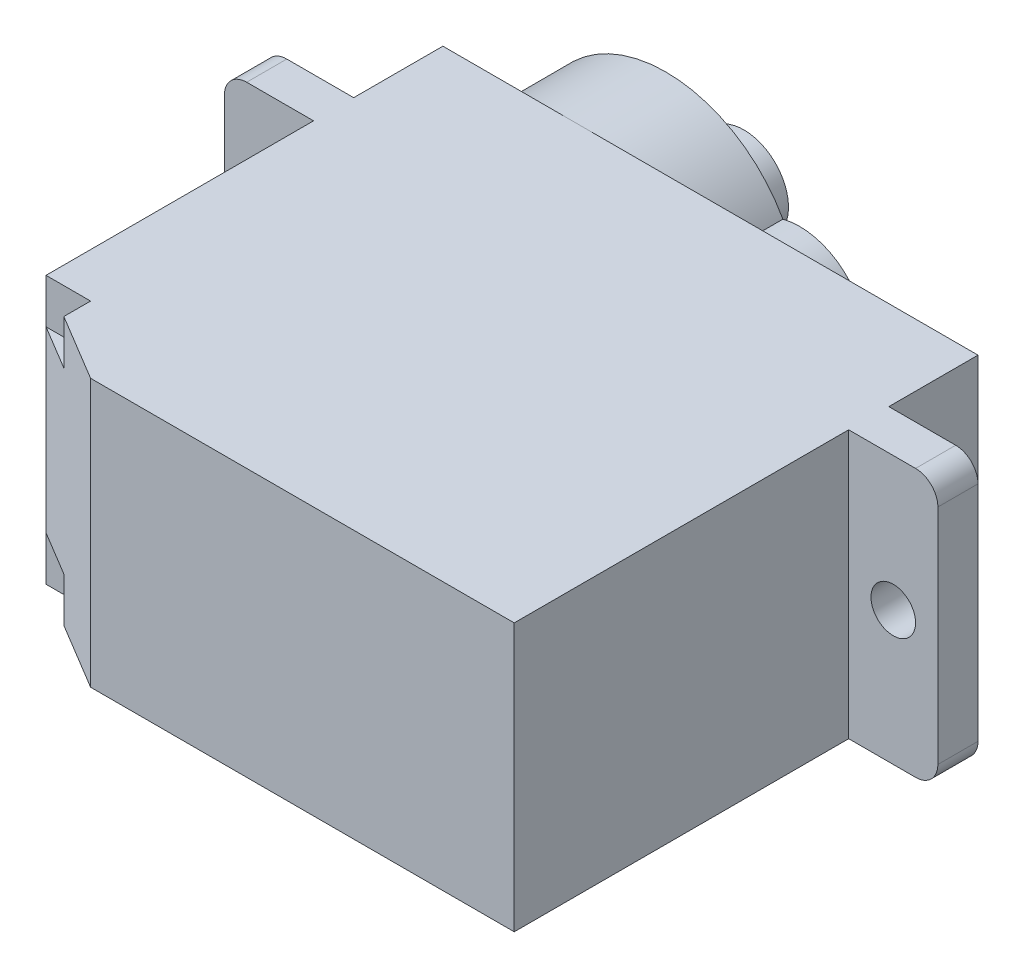
ISO-10303-21;
HEADER;
FILE_DESCRIPTION(('STEP AP214'),'2;1');
FILE_NAME('part.step','',(''),(''),'','','');
FILE_SCHEMA(('AUTOMOTIVE_DESIGN { 1 0 10303 214 1 1 1 1 }'));
ENDSEC;
DATA;
#1=APPLICATION_CONTEXT('core data for automotive mechanical design processes');
#2=APPLICATION_PROTOCOL_DEFINITION('international standard','automotive_design',2000,#1);
#3=PRODUCT_CONTEXT('',#1,'mechanical');
#4=PRODUCT('Part','Part','',(#3));
#5=PRODUCT_RELATED_PRODUCT_CATEGORY('part','',(#4));
#6=PRODUCT_DEFINITION_FORMATION('','',#4);
#7=PRODUCT_DEFINITION_CONTEXT('part definition',#1,'design');
#8=PRODUCT_DEFINITION('design','',#6,#7);
#9=PRODUCT_DEFINITION_SHAPE('','',#8);
#10=(LENGTH_UNIT() NAMED_UNIT(*) SI_UNIT(.MILLI.,.METRE.));
#11=(NAMED_UNIT(*) PLANE_ANGLE_UNIT() SI_UNIT($,.RADIAN.));
#12=(NAMED_UNIT(*) SI_UNIT($,.STERADIAN.) SOLID_ANGLE_UNIT());
#13=UNCERTAINTY_MEASURE_WITH_UNIT(LENGTH_MEASURE(1.E-05),#10,'distance_accuracy_value','');
#14=(GEOMETRIC_REPRESENTATION_CONTEXT(3) GLOBAL_UNCERTAINTY_ASSIGNED_CONTEXT((#13)) GLOBAL_UNIT_ASSIGNED_CONTEXT((#10,
#11,#12)) REPRESENTATION_CONTEXT('',''));
#15=CARTESIAN_POINT('',(0.,0.,0.));
#16=DIRECTION('',(0.,0.,1.));
#17=DIRECTION('',(1.,0.,0.));
#18=AXIS2_PLACEMENT_3D('',#15,#16,#17);
#19=CARTESIAN_POINT('',(0.,0.,12.));
#20=DIRECTION('',(0.,0.,-1.));
#21=DIRECTION('',(-1.,0.,0.));
#22=AXIS2_PLACEMENT_3D('',#19,#20,#21);
#23=PLANE('',#22);
#24=DIRECTION('',(0.,-1.,0.));
#25=VECTOR('',#24,1.);
#26=CARTESIAN_POINT('',(-10.,-6.,12.));
#27=LINE('',#26,#25);
#28=CARTESIAN_POINT('',(-10.,-4.,12.));
#29=VERTEX_POINT('',#28);
#30=CARTESIAN_POINT('',(-10.,-6.,12.));
#31=VERTEX_POINT('',#30);
#32=EDGE_CURVE('E232',#29,#31,#27,.T.);
#33=ORIENTED_EDGE('',*,*,#32,.F.);
#34=DIRECTION('',(1.,0.,0.));
#35=VECTOR('',#34,1.);
#36=CARTESIAN_POINT('',(-10.,-4.,12.));
#37=LINE('',#36,#35);
#38=CARTESIAN_POINT('',(-12.,-4.,12.));
#39=VERTEX_POINT('',#38);
#40=EDGE_CURVE('E235',#39,#29,#37,.T.);
#41=ORIENTED_EDGE('',*,*,#40,.F.);
#42=DIRECTION('',(0.,-1.,0.));
#43=VECTOR('',#42,1.);
#44=CARTESIAN_POINT('',(-12.,-6.,12.));
#45=LINE('',#44,#43);
#46=CARTESIAN_POINT('',(-12.,-6.,12.));
#47=VERTEX_POINT('',#46);
#48=EDGE_CURVE('E387',#39,#47,#45,.T.);
#49=ORIENTED_EDGE('',*,*,#48,.T.);
#50=DIRECTION('',(1.,0.,0.));
#51=VECTOR('',#50,1.);
#52=CARTESIAN_POINT('',(-12.,-6.,12.));
#53=LINE('',#52,#51);
#54=EDGE_CURVE('E392',#47,#31,#53,.T.);
#55=ORIENTED_EDGE('',*,*,#54,.T.);
#56=EDGE_LOOP('',(#33,#41,#49,#55));
#57=FACE_BOUND('',#56,.T.);
#58=ADVANCED_FACE('F37',(#57),#23,.F.);
#59=DIRECTION('',(-1.,0.,0.));
#60=VECTOR('',#59,1.);
#61=CARTESIAN_POINT('',(-12.,4.,12.));
#62=LINE('',#61,#60);
#63=CARTESIAN_POINT('',(-10.,4.,12.));
#64=VERTEX_POINT('',#63);
#65=CARTESIAN_POINT('',(-12.,4.,12.));
#66=VERTEX_POINT('',#65);
#67=EDGE_CURVE('E246',#64,#66,#62,.T.);
#68=ORIENTED_EDGE('',*,*,#67,.F.);
#69=DIRECTION('',(0.,-1.,0.));
#70=VECTOR('',#69,1.);
#71=CARTESIAN_POINT('',(-10.,4.,12.));
#72=LINE('',#71,#70);
#73=CARTESIAN_POINT('',(-10.,6.,12.));
#74=VERTEX_POINT('',#73);
#75=EDGE_CURVE('E243',#74,#64,#72,.T.);
#76=ORIENTED_EDGE('',*,*,#75,.F.);
#77=DIRECTION('',(-1.,0.,0.));
#78=VECTOR('',#77,1.);
#79=CARTESIAN_POINT('',(-12.,6.,12.));
#80=LINE('',#79,#78);
#81=CARTESIAN_POINT('',(-12.,6.,12.));
#82=VERTEX_POINT('',#81);
#83=EDGE_CURVE('E385',#74,#82,#80,.T.);
#84=ORIENTED_EDGE('',*,*,#83,.T.);
#85=EDGE_CURVE('E389',#82,#66,#45,.T.);
#86=ORIENTED_EDGE('',*,*,#85,.T.);
#87=EDGE_LOOP('',(#68,#76,#84,#86));
#88=FACE_BOUND('',#87,.T.);
#89=ADVANCED_FACE('F456',(#88),#23,.F.);
#90=CARTESIAN_POINT('',(0.,0.,-5.8));
#91=DIRECTION('',(0.,0.,1.));
#92=DIRECTION('',(1.,0.,0.));
#93=AXIS2_PLACEMENT_3D('',#90,#91,#92);
#94=PLANE('',#93);
#95=CARTESIAN_POINT('',(0.,0.,-5.8));
#96=DIRECTION('',(0.,0.,-1.));
#97=DIRECTION('',(-1.,0.,0.));
#98=AXIS2_PLACEMENT_3D('',#95,#96,#97);
#99=CIRCLE('',#98,3.);
#100=CARTESIAN_POINT('',(-0.75,-2.90473750965556,-5.8));
#101=VERTEX_POINT('',#100);
#102=CARTESIAN_POINT('',(-0.750000000000002,2.90473750965556,-5.8));
#103=VERTEX_POINT('',#102);
#104=EDGE_CURVE('E264',#101,#103,#99,.F.);
#105=ORIENTED_EDGE('',*,*,#104,.T.);
#106=CARTESIAN_POINT('',(-6.,0.,-5.8));
#107=DIRECTION('',(0.,0.,-1.));
#108=DIRECTION('',(-1.,0.,0.));
#109=AXIS2_PLACEMENT_3D('',#106,#107,#108);
#110=CIRCLE('',#109,6.);
#111=CARTESIAN_POINT('',(-6.,6.,-5.8));
#112=VERTEX_POINT('',#111);
#113=EDGE_CURVE('E258',#103,#112,#110,.F.);
#114=ORIENTED_EDGE('',*,*,#113,.T.);
#115=DIRECTION('',(-1.,0.,0.));
#116=VECTOR('',#115,1.);
#117=CARTESIAN_POINT('',(12.,6.,-5.8));
#118=LINE('',#117,#116);
#119=CARTESIAN_POINT('',(12.,6.,-5.8));
#120=VERTEX_POINT('',#119);
#121=EDGE_CURVE('E278',#120,#112,#118,.T.);
#122=ORIENTED_EDGE('',*,*,#121,.F.);
#123=DIRECTION('',(0.,-1.,0.));
#124=VECTOR('',#123,1.);
#125=CARTESIAN_POINT('',(12.,6.,-5.8));
#126=LINE('',#125,#124);
#127=CARTESIAN_POINT('',(12.,-6.,-5.8));
#128=VERTEX_POINT('',#127);
#129=EDGE_CURVE('E290',#120,#128,#126,.T.);
#130=ORIENTED_EDGE('',*,*,#129,.T.);
#131=DIRECTION('',(-1.,0.,0.));
#132=VECTOR('',#131,1.);
#133=CARTESIAN_POINT('',(12.,-6.,-5.8));
#134=LINE('',#133,#132);
#135=CARTESIAN_POINT('',(-6.,-6.,-5.8));
#136=VERTEX_POINT('',#135);
#137=EDGE_CURVE('E287',#128,#136,#134,.T.);
#138=ORIENTED_EDGE('',*,*,#137,.T.);
#139=EDGE_CURVE('E270',#136,#101,#110,.F.);
#140=ORIENTED_EDGE('',*,*,#139,.T.);
#141=EDGE_LOOP('',(#105,#114,#122,#130,#138,#140));
#142=FACE_BOUND('',#141,.T.);
#143=ADVANCED_FACE('F432',(#142),#94,.F.);
#144=CARTESIAN_POINT('',(-12.,6.,-5.8));
#145=VERTEX_POINT('',#144);
#146=EDGE_CURVE('E282',#112,#145,#118,.T.);
#147=ORIENTED_EDGE('',*,*,#146,.F.);
#148=CARTESIAN_POINT('',(-12.,0.,-5.8));
#149=VERTEX_POINT('',#148);
#150=EDGE_CURVE('E46',#112,#149,#110,.F.);
#151=ORIENTED_EDGE('',*,*,#150,.T.);
#152=DIRECTION('',(0.,-1.,0.));
#153=VECTOR('',#152,1.);
#154=CARTESIAN_POINT('',(-12.,6.,-5.8));
#155=LINE('',#154,#153);
#156=EDGE_CURVE('E283',#145,#149,#155,.T.);
#157=ORIENTED_EDGE('',*,*,#156,.F.);
#158=EDGE_LOOP('',(#147,#151,#157));
#159=FACE_BOUND('',#158,.T.);
#160=ADVANCED_FACE('F421',(#159),#94,.F.);
#161=CARTESIAN_POINT('',(15.,5.,-1.8));
#162=DIRECTION('',(0.,0.,-1.));
#163=DIRECTION('',(-1.,0.,0.));
#164=AXIS2_PLACEMENT_3D('',#161,#162,#163);
#165=PLANE('',#164);
#166=CARTESIAN_POINT('',(-14.,0.,-1.8));
#167=DIRECTION('',(0.,0.,-1.));
#168=DIRECTION('',(-1.,0.,0.));
#169=AXIS2_PLACEMENT_3D('',#166,#167,#168);
#170=CIRCLE('',#169,1.);
#171=CARTESIAN_POINT('',(-15.,0.,-1.8));
#172=VERTEX_POINT('',#171);
#173=EDGE_CURVE('E315',#172,#172,#170,.T.);
#174=ORIENTED_EDGE('',*,*,#173,.F.);
#175=EDGE_LOOP('',(#174));
#176=FACE_BOUND('',#175,.T.);
#177=DIRECTION('',(1.,0.,0.));
#178=VECTOR('',#177,1.);
#179=CARTESIAN_POINT('',(-12.,6.,-1.8));
#180=LINE('',#179,#178);
#181=CARTESIAN_POINT('',(-15.,6.,-1.8));
#182=VERTEX_POINT('',#181);
#183=CARTESIAN_POINT('',(-12.,6.,-1.8));
#184=VERTEX_POINT('',#183);
#185=EDGE_CURVE('E321',#182,#184,#180,.T.);
#186=ORIENTED_EDGE('',*,*,#185,.T.);
#187=DIRECTION('',(0.,-1.,0.));
#188=VECTOR('',#187,1.);
#189=CARTESIAN_POINT('',(-12.,6.,-1.8));
#190=LINE('',#189,#188);
#191=CARTESIAN_POINT('',(-12.,-5.99999999999999,-1.8));
#192=VERTEX_POINT('',#191);
#193=EDGE_CURVE('E277',#184,#192,#190,.T.);
#194=ORIENTED_EDGE('',*,*,#193,.T.);
#195=DIRECTION('',(-1.,0.,0.));
#196=VECTOR('',#195,1.);
#197=CARTESIAN_POINT('',(12.,-6.,-1.8));
#198=LINE('',#197,#196);
#199=CARTESIAN_POINT('',(-15.,-6.,-1.8));
#200=VERTEX_POINT('',#199);
#201=EDGE_CURVE('E330',#192,#200,#198,.T.);
#202=ORIENTED_EDGE('',*,*,#201,.T.);
#203=CARTESIAN_POINT('',(-15.,-5.,-1.8));
#204=DIRECTION('',(0.,0.,-1.));
#205=DIRECTION('',(-1.,0.,0.));
#206=AXIS2_PLACEMENT_3D('',#203,#204,#205);
#207=CIRCLE('',#206,1.);
#208=CARTESIAN_POINT('',(-16.,-4.99999999999999,-1.8));
#209=VERTEX_POINT('',#208);
#210=EDGE_CURVE('E333',#200,#209,#207,.T.);
#211=ORIENTED_EDGE('',*,*,#210,.T.);
#212=DIRECTION('',(0.,1.,0.));
#213=VECTOR('',#212,1.);
#214=CARTESIAN_POINT('',(-16.,-4.99999999999999,-1.8));
#215=LINE('',#214,#213);
#216=CARTESIAN_POINT('',(-16.,4.99999999999999,-1.8));
#217=VERTEX_POINT('',#216);
#218=EDGE_CURVE('E335',#209,#217,#215,.T.);
#219=ORIENTED_EDGE('',*,*,#218,.T.);
#220=CARTESIAN_POINT('',(-15.,5.,-1.8));
#221=DIRECTION('',(0.,0.,-1.));
#222=DIRECTION('',(1.,0.,0.));
#223=AXIS2_PLACEMENT_3D('',#220,#221,#222);
#224=CIRCLE('',#223,1.);
#225=EDGE_CURVE('E337',#217,#182,#224,.T.);
#226=ORIENTED_EDGE('',*,*,#225,.T.);
#227=EDGE_LOOP('',(#186,#194,#202,#211,#219,#226));
#228=FACE_BOUND('',#227,.T.);
#229=ADVANCED_FACE('F478',(#176,#228),#165,.T.);
#230=CARTESIAN_POINT('',(12.,-6.,12.));
#231=DIRECTION('',(-1.,0.,0.));
#232=DIRECTION('',(0.,0.,1.));
#233=AXIS2_PLACEMENT_3D('',#230,#231,#232);
#234=PLANE('',#233);
#235=DIRECTION('',(0.,1.,0.));
#236=VECTOR('',#235,1.);
#237=CARTESIAN_POINT('',(12.,-6.,0.));
#238=LINE('',#237,#236);
#239=CARTESIAN_POINT('',(12.,-6.,0.));
#240=VERTEX_POINT('',#239);
#241=CARTESIAN_POINT('',(12.,6.,0.));
#242=VERTEX_POINT('',#241);
#243=EDGE_CURVE('E384',#240,#242,#238,.T.);
#244=ORIENTED_EDGE('',*,*,#243,.T.);
#245=DIRECTION('',(0.,0.,-1.));
#246=VECTOR('',#245,1.);
#247=CARTESIAN_POINT('',(12.,6.,12.));
#248=LINE('',#247,#246);
#249=CARTESIAN_POINT('',(12.,6.,15.));
#250=VERTEX_POINT('',#249);
#251=EDGE_CURVE('E41',#250,#242,#248,.T.);
#252=ORIENTED_EDGE('',*,*,#251,.F.);
#253=DIRECTION('',(0.,1.,0.));
#254=VECTOR('',#253,1.);
#255=CARTESIAN_POINT('',(12.,-6.,15.));
#256=LINE('',#255,#254);
#257=CARTESIAN_POINT('',(12.,-6.,15.));
#258=VERTEX_POINT('',#257);
#259=EDGE_CURVE('E230',#258,#250,#256,.T.);
#260=ORIENTED_EDGE('',*,*,#259,.F.);
#261=DIRECTION('',(0.,0.,-1.));
#262=VECTOR('',#261,1.);
#263=CARTESIAN_POINT('',(12.,-6.,12.));
#264=LINE('',#263,#262);
#265=EDGE_CURVE('E395',#258,#240,#264,.T.);
#266=ORIENTED_EDGE('',*,*,#265,.T.);
#267=EDGE_LOOP('',(#244,#252,#260,#266));
#268=FACE_BOUND('',#267,.T.);
#269=ADVANCED_FACE('F39',(#268),#234,.F.);
#270=CARTESIAN_POINT('',(-12.,6.,12.));
#271=DIRECTION('',(0.,-1.,0.));
#272=DIRECTION('',(0.,0.,-1.));
#273=AXIS2_PLACEMENT_3D('',#270,#271,#272);
#274=PLANE('',#273);
#275=DIRECTION('',(0.,0.,-1.));
#276=VECTOR('',#275,1.);
#277=CARTESIAN_POINT('',(-10.,6.,15.));
#278=LINE('',#277,#276);
#279=CARTESIAN_POINT('',(-10.,6.,13.2));
#280=VERTEX_POINT('',#279);
#281=EDGE_CURVE('E225',#280,#74,#278,.T.);
#282=ORIENTED_EDGE('',*,*,#281,.F.);
#283=DIRECTION('',(-0.857492925712544,0.,-0.514495755427526));
#284=VECTOR('',#283,1.);
#285=CARTESIAN_POINT('',(-7.,6.,15.));
#286=LINE('',#285,#284);
#287=CARTESIAN_POINT('',(-7.,6.,15.));
#288=VERTEX_POINT('',#287);
#289=EDGE_CURVE('E211',#288,#280,#286,.T.);
#290=ORIENTED_EDGE('',*,*,#289,.F.);
#291=DIRECTION('',(-1.,0.,0.));
#292=VECTOR('',#291,1.);
#293=CARTESIAN_POINT('',(-10.,6.,15.));
#294=LINE('',#293,#292);
#295=EDGE_CURVE('E223',#250,#288,#294,.T.);
#296=ORIENTED_EDGE('',*,*,#295,.F.);
#297=ORIENTED_EDGE('',*,*,#251,.T.);
#298=DIRECTION('',(1.,0.,0.));
#299=VECTOR('',#298,1.);
#300=CARTESIAN_POINT('',(-12.,6.,0.));
#301=LINE('',#300,#299);
#302=CARTESIAN_POINT('',(15.,6.,0.));
#303=VERTEX_POINT('',#302);
#304=EDGE_CURVE('E357',#242,#303,#301,.T.);
#305=ORIENTED_EDGE('',*,*,#304,.T.);
#306=DIRECTION('',(0.,0.,1.));
#307=VECTOR('',#306,1.);
#308=CARTESIAN_POINT('',(15.,6.,-1.8));
#309=LINE('',#308,#307);
#310=CARTESIAN_POINT('',(15.,6.,-1.8));
#311=VERTEX_POINT('',#310);
#312=EDGE_CURVE('E381',#311,#303,#309,.T.);
#313=ORIENTED_EDGE('',*,*,#312,.F.);
#314=CARTESIAN_POINT('',(12.,6.,-1.8));
#315=VERTEX_POINT('',#314);
#316=EDGE_CURVE('E324',#315,#311,#180,.T.);
#317=ORIENTED_EDGE('',*,*,#316,.F.);
#318=DIRECTION('',(0.,0.,1.));
#319=VECTOR('',#318,1.);
#320=CARTESIAN_POINT('',(12.,6.,-5.8));
#321=LINE('',#320,#319);
#322=EDGE_CURVE('E297',#120,#315,#321,.T.);
#323=ORIENTED_EDGE('',*,*,#322,.F.);
#324=ORIENTED_EDGE('',*,*,#121,.T.);
#325=ORIENTED_EDGE('',*,*,#146,.T.);
#326=DIRECTION('',(0.,0.,1.));
#327=VECTOR('',#326,1.);
#328=CARTESIAN_POINT('',(-12.,6.,-5.8));
#329=LINE('',#328,#327);
#330=EDGE_CURVE('E292',#145,#184,#329,.T.);
#331=ORIENTED_EDGE('',*,*,#330,.T.);
#332=ORIENTED_EDGE('',*,*,#185,.F.);
#333=DIRECTION('',(0.,0.,1.));
#334=VECTOR('',#333,1.);
#335=CARTESIAN_POINT('',(-15.,6.,-1.8));
#336=LINE('',#335,#334);
#337=CARTESIAN_POINT('',(-15.,6.,0.));
#338=VERTEX_POINT('',#337);
#339=EDGE_CURVE('E340',#182,#338,#336,.T.);
#340=ORIENTED_EDGE('',*,*,#339,.T.);
#341=CARTESIAN_POINT('',(-12.,6.,0.));
#342=VERTEX_POINT('',#341);
#343=EDGE_CURVE('E358',#338,#342,#301,.T.);
#344=ORIENTED_EDGE('',*,*,#343,.T.);
#345=DIRECTION('',(0.,0.,-1.));
#346=VECTOR('',#345,1.);
#347=CARTESIAN_POINT('',(-12.,6.,12.));
#348=LINE('',#347,#346);
#349=EDGE_CURVE('E404',#82,#342,#348,.T.);
#350=ORIENTED_EDGE('',*,*,#349,.F.);
#351=ORIENTED_EDGE('',*,*,#83,.F.);
#352=EDGE_LOOP('',(#282,#290,#296,#297,#305,#313,#317,#323,#324,#325,#331,#332,#340,#344,#350,#351));
#353=FACE_BOUND('',#352,.T.);
#354=ADVANCED_FACE('F221',(#353),#274,.F.);
#355=CARTESIAN_POINT('',(-12.,-6.,12.));
#356=DIRECTION('',(1.,0.,0.));
#357=DIRECTION('',(0.,0.,-1.));
#358=AXIS2_PLACEMENT_3D('',#355,#356,#357);
#359=PLANE('',#358);
#360=ORIENTED_EDGE('',*,*,#48,.F.);
#361=DIRECTION('',(0.,1.,0.));
#362=VECTOR('',#361,1.);
#363=CARTESIAN_POINT('',(-12.,-6.,12.));
#364=LINE('',#363,#362);
#365=EDGE_CURVE('E216',#39,#66,#364,.T.);
#366=ORIENTED_EDGE('',*,*,#365,.T.);
#367=ORIENTED_EDGE('',*,*,#85,.F.);
#368=ORIENTED_EDGE('',*,*,#349,.T.);
#369=DIRECTION('',(0.,-1.,0.));
#370=VECTOR('',#369,1.);
#371=CARTESIAN_POINT('',(-12.,-6.,0.));
#372=LINE('',#371,#370);
#373=CARTESIAN_POINT('',(-12.,-6.,0.));
#374=VERTEX_POINT('',#373);
#375=EDGE_CURVE('E388',#342,#374,#372,.T.);
#376=ORIENTED_EDGE('',*,*,#375,.T.);
#377=DIRECTION('',(0.,0.,-1.));
#378=VECTOR('',#377,1.);
#379=CARTESIAN_POINT('',(-12.,-6.,12.));
#380=LINE('',#379,#378);
#381=EDGE_CURVE('E402',#47,#374,#380,.T.);
#382=ORIENTED_EDGE('',*,*,#381,.F.);
#383=EDGE_LOOP('',(#360,#366,#367,#368,#376,#382));
#384=FACE_BOUND('',#383,.T.);
#385=ADVANCED_FACE('F471',(#384),#359,.F.);
#386=CARTESIAN_POINT('',(-12.,-6.,12.));
#387=DIRECTION('',(0.,1.,0.));
#388=DIRECTION('',(0.,0.,1.));
#389=AXIS2_PLACEMENT_3D('',#386,#387,#388);
#390=PLANE('',#389);
#391=DIRECTION('',(1.,0.,0.));
#392=VECTOR('',#391,1.);
#393=CARTESIAN_POINT('',(12.,-6.,15.));
#394=LINE('',#393,#392);
#395=CARTESIAN_POINT('',(-7.,-6.,15.));
#396=VERTEX_POINT('',#395);
#397=EDGE_CURVE('E231',#396,#258,#394,.T.);
#398=ORIENTED_EDGE('',*,*,#397,.F.);
#399=DIRECTION('',(-0.857492925712544,0.,-0.514495755427526));
#400=VECTOR('',#399,1.);
#401=CARTESIAN_POINT('',(-7.,-6.,15.));
#402=LINE('',#401,#400);
#403=CARTESIAN_POINT('',(-10.,-6.,13.2));
#404=VERTEX_POINT('',#403);
#405=EDGE_CURVE('E54',#396,#404,#402,.T.);
#406=ORIENTED_EDGE('',*,*,#405,.T.);
#407=DIRECTION('',(0.,0.,-1.));
#408=VECTOR('',#407,1.);
#409=CARTESIAN_POINT('',(-10.,-6.,15.));
#410=LINE('',#409,#408);
#411=EDGE_CURVE('E242',#404,#31,#410,.T.);
#412=ORIENTED_EDGE('',*,*,#411,.T.);
#413=ORIENTED_EDGE('',*,*,#54,.F.);
#414=ORIENTED_EDGE('',*,*,#381,.T.);
#415=DIRECTION('',(-1.,0.,0.));
#416=VECTOR('',#415,1.);
#417=CARTESIAN_POINT('',(-12.,-6.,0.));
#418=LINE('',#417,#416);
#419=CARTESIAN_POINT('',(-15.,-6.,0.));
#420=VERTEX_POINT('',#419);
#421=EDGE_CURVE('E347',#374,#420,#418,.T.);
#422=ORIENTED_EDGE('',*,*,#421,.T.);
#423=DIRECTION('',(0.,0.,1.));
#424=VECTOR('',#423,1.);
#425=CARTESIAN_POINT('',(-15.,-6.,-1.8));
#426=LINE('',#425,#424);
#427=EDGE_CURVE('E369',#200,#420,#426,.T.);
#428=ORIENTED_EDGE('',*,*,#427,.F.);
#429=ORIENTED_EDGE('',*,*,#201,.F.);
#430=DIRECTION('',(0.,0.,1.));
#431=VECTOR('',#430,1.);
#432=CARTESIAN_POINT('',(-12.,-6.,-5.8));
#433=LINE('',#432,#431);
#434=CARTESIAN_POINT('',(-12.,-6.,-5.8));
#435=VERTEX_POINT('',#434);
#436=EDGE_CURVE('E304',#435,#192,#433,.T.);
#437=ORIENTED_EDGE('',*,*,#436,.F.);
#438=EDGE_CURVE('E286',#136,#435,#134,.T.);
#439=ORIENTED_EDGE('',*,*,#438,.F.);
#440=ORIENTED_EDGE('',*,*,#137,.F.);
#441=DIRECTION('',(0.,0.,1.));
#442=VECTOR('',#441,1.);
#443=CARTESIAN_POINT('',(12.,-6.,-5.8));
#444=LINE('',#443,#442);
#445=CARTESIAN_POINT('',(12.,-6.,-1.8));
#446=VERTEX_POINT('',#445);
#447=EDGE_CURVE('E301',#128,#446,#444,.T.);
#448=ORIENTED_EDGE('',*,*,#447,.T.);
#449=CARTESIAN_POINT('',(15.,-6.,-1.8));
#450=VERTEX_POINT('',#449);
#451=EDGE_CURVE('E331',#450,#446,#198,.T.);
#452=ORIENTED_EDGE('',*,*,#451,.F.);
#453=DIRECTION('',(0.,0.,1.));
#454=VECTOR('',#453,1.);
#455=CARTESIAN_POINT('',(15.,-6.,-1.8));
#456=LINE('',#455,#454);
#457=CARTESIAN_POINT('',(15.,-6.,0.));
#458=VERTEX_POINT('',#457);
#459=EDGE_CURVE('E372',#450,#458,#456,.T.);
#460=ORIENTED_EDGE('',*,*,#459,.T.);
#461=EDGE_CURVE('E348',#458,#240,#418,.T.);
#462=ORIENTED_EDGE('',*,*,#461,.T.);
#463=ORIENTED_EDGE('',*,*,#265,.F.);
#464=EDGE_LOOP('',(#398,#406,#412,#413,#414,#422,#428,#429,#437,#439,#440,#448,#452,#460,#462,#463));
#465=FACE_BOUND('',#464,.T.);
#466=ADVANCED_FACE('F467',(#465),#390,.F.);
#467=CARTESIAN_POINT('',(15.,5.,0.));
#468=DIRECTION('',(0.,0.,-1.));
#469=DIRECTION('',(-1.,0.,0.));
#470=AXIS2_PLACEMENT_3D('',#467,#468,#469);
#471=PLANE('',#470);
#472=ORIENTED_EDGE('',*,*,#243,.F.);
#473=ORIENTED_EDGE('',*,*,#461,.F.);
#474=CARTESIAN_POINT('',(15.,-5.,0.));
#475=DIRECTION('',(0.,0.,-1.));
#476=DIRECTION('',(1.,0.,0.));
#477=AXIS2_PLACEMENT_3D('',#474,#475,#476);
#478=CIRCLE('',#477,1.);
#479=CARTESIAN_POINT('',(16.,-5.,0.));
#480=VERTEX_POINT('',#479);
#481=EDGE_CURVE('E344',#480,#458,#478,.T.);
#482=ORIENTED_EDGE('',*,*,#481,.F.);
#483=DIRECTION('',(0.,-1.,0.));
#484=VECTOR('',#483,1.);
#485=CARTESIAN_POINT('',(16.,4.99999999999999,0.));
#486=LINE('',#485,#484);
#487=CARTESIAN_POINT('',(16.,4.99999999999999,0.));
#488=VERTEX_POINT('',#487);
#489=EDGE_CURVE('E342',#488,#480,#486,.T.);
#490=ORIENTED_EDGE('',*,*,#489,.F.);
#491=CARTESIAN_POINT('',(15.,5.,0.));
#492=DIRECTION('',(0.,0.,-1.));
#493=DIRECTION('',(-1.,0.,0.));
#494=AXIS2_PLACEMENT_3D('',#491,#492,#493);
#495=CIRCLE('',#494,1.);
#496=EDGE_CURVE('E318',#303,#488,#495,.T.);
#497=ORIENTED_EDGE('',*,*,#496,.F.);
#498=ORIENTED_EDGE('',*,*,#304,.F.);
#499=EDGE_LOOP('',(#472,#473,#482,#490,#497,#498));
#500=FACE_BOUND('',#499,.T.);
#501=CARTESIAN_POINT('',(14.,0.,0.));
#502=DIRECTION('',(0.,0.,-1.));
#503=DIRECTION('',(-1.,0.,0.));
#504=AXIS2_PLACEMENT_3D('',#501,#502,#503);
#505=CIRCLE('',#504,1.);
#506=CARTESIAN_POINT('',(13.,0.,0.));
#507=VERTEX_POINT('',#506);
#508=EDGE_CURVE('E300',#507,#507,#505,.T.);
#509=ORIENTED_EDGE('',*,*,#508,.T.);
#510=EDGE_LOOP('',(#509));
#511=FACE_BOUND('',#510,.T.);
#512=ADVANCED_FACE('F470',(#500,#511),#471,.F.);
#513=DIRECTION('',(0.,-1.,0.));
#514=VECTOR('',#513,1.);
#515=CARTESIAN_POINT('',(12.,6.,-1.8));
#516=LINE('',#515,#514);
#517=EDGE_CURVE('E294',#315,#446,#516,.T.);
#518=ORIENTED_EDGE('',*,*,#517,.F.);
#519=ORIENTED_EDGE('',*,*,#316,.T.);
#520=CARTESIAN_POINT('',(15.,5.,-1.8));
#521=DIRECTION('',(0.,0.,-1.));
#522=DIRECTION('',(-1.,0.,0.));
#523=AXIS2_PLACEMENT_3D('',#520,#521,#522);
#524=CIRCLE('',#523,1.);
#525=CARTESIAN_POINT('',(16.,4.99999999999999,-1.8));
#526=VERTEX_POINT('',#525);
#527=EDGE_CURVE('E323',#311,#526,#524,.T.);
#528=ORIENTED_EDGE('',*,*,#527,.T.);
#529=DIRECTION('',(0.,-1.,0.));
#530=VECTOR('',#529,1.);
#531=CARTESIAN_POINT('',(16.,4.99999999999999,-1.8));
#532=LINE('',#531,#530);
#533=CARTESIAN_POINT('',(16.,-5.,-1.8));
#534=VERTEX_POINT('',#533);
#535=EDGE_CURVE('E326',#526,#534,#532,.T.);
#536=ORIENTED_EDGE('',*,*,#535,.T.);
#537=CARTESIAN_POINT('',(15.,-5.,-1.8));
#538=DIRECTION('',(0.,0.,-1.));
#539=DIRECTION('',(1.,0.,0.));
#540=AXIS2_PLACEMENT_3D('',#537,#538,#539);
#541=CIRCLE('',#540,1.);
#542=EDGE_CURVE('E328',#534,#450,#541,.T.);
#543=ORIENTED_EDGE('',*,*,#542,.T.);
#544=ORIENTED_EDGE('',*,*,#451,.T.);
#545=EDGE_LOOP('',(#518,#519,#528,#536,#543,#544));
#546=FACE_BOUND('',#545,.T.);
#547=CARTESIAN_POINT('',(14.,0.,-1.8));
#548=DIRECTION('',(0.,0.,-1.));
#549=DIRECTION('',(-1.,0.,0.));
#550=AXIS2_PLACEMENT_3D('',#547,#548,#549);
#551=CIRCLE('',#550,1.);
#552=CARTESIAN_POINT('',(13.,0.,-1.8));
#553=VERTEX_POINT('',#552);
#554=EDGE_CURVE('E309',#553,#553,#551,.T.);
#555=ORIENTED_EDGE('',*,*,#554,.F.);
#556=EDGE_LOOP('',(#555));
#557=FACE_BOUND('',#556,.T.);
#558=ADVANCED_FACE('F485',(#546,#557),#165,.T.);
#559=ORIENTED_EDGE('',*,*,#375,.F.);
#560=ORIENTED_EDGE('',*,*,#343,.F.);
#561=CARTESIAN_POINT('',(-15.,5.,0.));
#562=DIRECTION('',(0.,0.,-1.));
#563=DIRECTION('',(1.,0.,0.));
#564=AXIS2_PLACEMENT_3D('',#561,#562,#563);
#565=CIRCLE('',#564,1.);
#566=CARTESIAN_POINT('',(-16.,4.99999999999999,0.));
#567=VERTEX_POINT('',#566);
#568=EDGE_CURVE('E355',#567,#338,#565,.T.);
#569=ORIENTED_EDGE('',*,*,#568,.F.);
#570=DIRECTION('',(0.,1.,0.));
#571=VECTOR('',#570,1.);
#572=CARTESIAN_POINT('',(-16.,-4.99999999999999,0.));
#573=LINE('',#572,#571);
#574=CARTESIAN_POINT('',(-16.,-4.99999999999999,0.));
#575=VERTEX_POINT('',#574);
#576=EDGE_CURVE('E353',#575,#567,#573,.T.);
#577=ORIENTED_EDGE('',*,*,#576,.F.);
#578=CARTESIAN_POINT('',(-15.,-5.,0.));
#579=DIRECTION('',(0.,0.,-1.));
#580=DIRECTION('',(-1.,0.,0.));
#581=AXIS2_PLACEMENT_3D('',#578,#579,#580);
#582=CIRCLE('',#581,1.);
#583=EDGE_CURVE('E351',#420,#575,#582,.T.);
#584=ORIENTED_EDGE('',*,*,#583,.F.);
#585=ORIENTED_EDGE('',*,*,#421,.F.);
#586=EDGE_LOOP('',(#559,#560,#569,#577,#584,#585));
#587=FACE_BOUND('',#586,.T.);
#588=CARTESIAN_POINT('',(-14.,0.,0.));
#589=DIRECTION('',(0.,0.,-1.));
#590=DIRECTION('',(-1.,0.,0.));
#591=AXIS2_PLACEMENT_3D('',#588,#589,#590);
#592=CIRCLE('',#591,1.);
#593=CARTESIAN_POINT('',(-15.,0.,0.));
#594=VERTEX_POINT('',#593);
#595=EDGE_CURVE('E312',#594,#594,#592,.T.);
#596=ORIENTED_EDGE('',*,*,#595,.T.);
#597=EDGE_LOOP('',(#596));
#598=FACE_BOUND('',#597,.T.);
#599=ADVANCED_FACE('F523',(#587,#598),#471,.F.);
#600=CARTESIAN_POINT('',(15.,5.,-1.8));
#601=DIRECTION('',(0.,0.,1.));
#602=DIRECTION('',(1.,0.,0.));
#603=AXIS2_PLACEMENT_3D('',#600,#601,#602);
#604=CYLINDRICAL_SURFACE('',#603,1.);
#605=ORIENTED_EDGE('',*,*,#496,.T.);
#606=DIRECTION('',(0.,0.,1.));
#607=VECTOR('',#606,1.);
#608=CARTESIAN_POINT('',(16.,4.99999999999999,-1.8));
#609=LINE('',#608,#607);
#610=EDGE_CURVE('E378',#526,#488,#609,.T.);
#611=ORIENTED_EDGE('',*,*,#610,.F.);
#612=ORIENTED_EDGE('',*,*,#527,.F.);
#613=ORIENTED_EDGE('',*,*,#312,.T.);
#614=EDGE_LOOP('',(#605,#611,#612,#613));
#615=FACE_BOUND('',#614,.T.);
#616=ADVANCED_FACE('F465',(#615),#604,.T.);
#617=CARTESIAN_POINT('',(16.,4.99999999999999,-1.8));
#618=DIRECTION('',(-1.,0.,0.));
#619=DIRECTION('',(0.,0.,1.));
#620=AXIS2_PLACEMENT_3D('',#617,#618,#619);
#621=PLANE('',#620);
#622=ORIENTED_EDGE('',*,*,#489,.T.);
#623=DIRECTION('',(0.,0.,1.));
#624=VECTOR('',#623,1.);
#625=CARTESIAN_POINT('',(16.,-5.,-1.8));
#626=LINE('',#625,#624);
#627=EDGE_CURVE('E375',#534,#480,#626,.T.);
#628=ORIENTED_EDGE('',*,*,#627,.F.);
#629=ORIENTED_EDGE('',*,*,#535,.F.);
#630=ORIENTED_EDGE('',*,*,#610,.T.);
#631=EDGE_LOOP('',(#622,#628,#629,#630));
#632=FACE_BOUND('',#631,.T.);
#633=ADVANCED_FACE('F499',(#632),#621,.F.);
#634=CARTESIAN_POINT('',(15.,-5.,-1.8));
#635=DIRECTION('',(0.,0.,1.));
#636=DIRECTION('',(1.,0.,0.));
#637=AXIS2_PLACEMENT_3D('',#634,#635,#636);
#638=CYLINDRICAL_SURFACE('',#637,1.);
#639=ORIENTED_EDGE('',*,*,#481,.T.);
#640=ORIENTED_EDGE('',*,*,#459,.F.);
#641=ORIENTED_EDGE('',*,*,#542,.F.);
#642=ORIENTED_EDGE('',*,*,#627,.T.);
#643=EDGE_LOOP('',(#639,#640,#641,#642));
#644=FACE_BOUND('',#643,.T.);
#645=ADVANCED_FACE('F495',(#644),#638,.T.);
#646=CARTESIAN_POINT('',(-15.,-5.,-1.8));
#647=DIRECTION('',(0.,0.,1.));
#648=DIRECTION('',(1.,0.,0.));
#649=AXIS2_PLACEMENT_3D('',#646,#647,#648);
#650=CYLINDRICAL_SURFACE('',#649,1.);
#651=ORIENTED_EDGE('',*,*,#583,.T.);
#652=DIRECTION('',(0.,0.,1.));
#653=VECTOR('',#652,1.);
#654=CARTESIAN_POINT('',(-16.,-4.99999999999999,-1.8));
#655=LINE('',#654,#653);
#656=EDGE_CURVE('E366',#209,#575,#655,.T.);
#657=ORIENTED_EDGE('',*,*,#656,.F.);
#658=ORIENTED_EDGE('',*,*,#210,.F.);
#659=ORIENTED_EDGE('',*,*,#427,.T.);
#660=EDGE_LOOP('',(#651,#657,#658,#659));
#661=FACE_BOUND('',#660,.T.);
#662=ADVANCED_FACE('F677',(#661),#650,.T.);
#663=CARTESIAN_POINT('',(-16.,-4.99999999999999,-1.8));
#664=DIRECTION('',(1.,0.,0.));
#665=DIRECTION('',(0.,0.,-1.));
#666=AXIS2_PLACEMENT_3D('',#663,#664,#665);
#667=PLANE('',#666);
#668=ORIENTED_EDGE('',*,*,#576,.T.);
#669=DIRECTION('',(0.,0.,1.));
#670=VECTOR('',#669,1.);
#671=CARTESIAN_POINT('',(-16.,4.99999999999999,-1.8));
#672=LINE('',#671,#670);
#673=EDGE_CURVE('E363',#217,#567,#672,.T.);
#674=ORIENTED_EDGE('',*,*,#673,.F.);
#675=ORIENTED_EDGE('',*,*,#218,.F.);
#676=ORIENTED_EDGE('',*,*,#656,.T.);
#677=EDGE_LOOP('',(#668,#674,#675,#676));
#678=FACE_BOUND('',#677,.T.);
#679=ADVANCED_FACE('F668',(#678),#667,.F.);
#680=CARTESIAN_POINT('',(-15.,5.,-1.8));
#681=DIRECTION('',(0.,0.,1.));
#682=DIRECTION('',(1.,0.,0.));
#683=AXIS2_PLACEMENT_3D('',#680,#681,#682);
#684=CYLINDRICAL_SURFACE('',#683,1.);
#685=ORIENTED_EDGE('',*,*,#568,.T.);
#686=ORIENTED_EDGE('',*,*,#339,.F.);
#687=ORIENTED_EDGE('',*,*,#225,.F.);
#688=ORIENTED_EDGE('',*,*,#673,.T.);
#689=EDGE_LOOP('',(#685,#686,#687,#688));
#690=FACE_BOUND('',#689,.T.);
#691=ADVANCED_FACE('F519',(#690),#684,.T.);
#692=CARTESIAN_POINT('',(-14.,0.,-1.8));
#693=DIRECTION('',(0.,0.,1.));
#694=DIRECTION('',(1.,0.,0.));
#695=AXIS2_PLACEMENT_3D('',#692,#693,#694);
#696=CYLINDRICAL_SURFACE('',#695,1.);
#697=ORIENTED_EDGE('',*,*,#173,.T.);
#698=EDGE_LOOP('',(#697));
#699=FACE_BOUND('',#698,.T.);
#700=ORIENTED_EDGE('',*,*,#595,.F.);
#701=EDGE_LOOP('',(#700));
#702=FACE_BOUND('',#701,.T.);
#703=ADVANCED_FACE('F648',(#699,#702),#696,.F.);
#704=CARTESIAN_POINT('',(14.,0.,-1.8));
#705=DIRECTION('',(0.,0.,1.));
#706=DIRECTION('',(1.,0.,0.));
#707=AXIS2_PLACEMENT_3D('',#704,#705,#706);
#708=CYLINDRICAL_SURFACE('',#707,1.);
#709=ORIENTED_EDGE('',*,*,#554,.T.);
#710=EDGE_LOOP('',(#709));
#711=FACE_BOUND('',#710,.T.);
#712=ORIENTED_EDGE('',*,*,#508,.F.);
#713=EDGE_LOOP('',(#712));
#714=FACE_BOUND('',#713,.T.);
#715=ADVANCED_FACE('F637',(#711,#714),#708,.F.);
#716=CARTESIAN_POINT('',(12.,6.,-5.8));
#717=DIRECTION('',(-1.,0.,0.));
#718=DIRECTION('',(0.,0.,1.));
#719=AXIS2_PLACEMENT_3D('',#716,#717,#718);
#720=PLANE('',#719);
#721=ORIENTED_EDGE('',*,*,#517,.T.);
#722=ORIENTED_EDGE('',*,*,#447,.F.);
#723=ORIENTED_EDGE('',*,*,#129,.F.);
#724=ORIENTED_EDGE('',*,*,#322,.T.);
#725=EDGE_LOOP('',(#721,#722,#723,#724));
#726=FACE_BOUND('',#725,.T.);
#727=ADVANCED_FACE('F507',(#726),#720,.F.);
#728=CARTESIAN_POINT('',(-12.,6.,-5.8));
#729=DIRECTION('',(-1.,0.,0.));
#730=DIRECTION('',(0.,0.,1.));
#731=AXIS2_PLACEMENT_3D('',#728,#729,#730);
#732=PLANE('',#731);
#733=ORIENTED_EDGE('',*,*,#193,.F.);
#734=ORIENTED_EDGE('',*,*,#330,.F.);
#735=ORIENTED_EDGE('',*,*,#156,.T.);
#736=EDGE_CURVE('E281',#149,#435,#155,.T.);
#737=ORIENTED_EDGE('',*,*,#736,.T.);
#738=ORIENTED_EDGE('',*,*,#436,.T.);
#739=EDGE_LOOP('',(#733,#734,#735,#737,#738));
#740=FACE_BOUND('',#739,.T.);
#741=ADVANCED_FACE('F428',(#740),#732,.T.);
#742=ORIENTED_EDGE('',*,*,#736,.F.);
#743=EDGE_CURVE('E410',#149,#136,#110,.F.);
#744=ORIENTED_EDGE('',*,*,#743,.T.);
#745=ORIENTED_EDGE('',*,*,#438,.T.);
#746=EDGE_LOOP('',(#742,#744,#745));
#747=FACE_BOUND('',#746,.T.);
#748=ADVANCED_FACE('F423',(#747),#94,.F.);
#749=CARTESIAN_POINT('',(-6.,0.,-9.8));
#750=DIRECTION('',(0.,0.,1.));
#751=DIRECTION('',(1.,0.,0.));
#752=AXIS2_PLACEMENT_3D('',#749,#750,#751);
#753=CYLINDRICAL_SURFACE('',#752,6.);
#754=ORIENTED_EDGE('',*,*,#113,.F.);
#755=DIRECTION('',(0.,0.,1.));
#756=VECTOR('',#755,1.);
#757=CARTESIAN_POINT('',(-0.750000000000002,2.90473750965556,-9.8));
#758=LINE('',#757,#756);
#759=CARTESIAN_POINT('',(-0.750000000000002,2.90473750965556,-9.8));
#760=VERTEX_POINT('',#759);
#761=EDGE_CURVE('E274',#760,#103,#758,.T.);
#762=ORIENTED_EDGE('',*,*,#761,.F.);
#763=CARTESIAN_POINT('',(-6.,0.,-9.8));
#764=DIRECTION('',(0.,0.,-1.));
#765=DIRECTION('',(-1.,0.,0.));
#766=AXIS2_PLACEMENT_3D('',#763,#764,#765);
#767=CIRCLE('',#766,6.);
#768=CARTESIAN_POINT('',(-0.75,-2.90473750965556,-9.8));
#769=VERTEX_POINT('',#768);
#770=EDGE_CURVE('E260',#760,#769,#767,.F.);
#771=ORIENTED_EDGE('',*,*,#770,.T.);
#772=DIRECTION('',(0.,0.,1.));
#773=VECTOR('',#772,1.);
#774=CARTESIAN_POINT('',(-0.75,-2.90473750965556,-9.8));
#775=LINE('',#774,#773);
#776=EDGE_CURVE('E267',#769,#101,#775,.T.);
#777=ORIENTED_EDGE('',*,*,#776,.T.);
#778=ORIENTED_EDGE('',*,*,#139,.F.);
#779=ORIENTED_EDGE('',*,*,#743,.F.);
#780=ORIENTED_EDGE('',*,*,#150,.F.);
#781=EDGE_LOOP('',(#754,#762,#771,#777,#778,#779,#780));
#782=FACE_BOUND('',#781,.T.);
#783=ADVANCED_FACE('F435',(#782),#753,.T.);
#784=CARTESIAN_POINT('',(0.,0.,-9.8));
#785=DIRECTION('',(0.,0.,1.));
#786=DIRECTION('',(1.,0.,0.));
#787=AXIS2_PLACEMENT_3D('',#784,#785,#786);
#788=CYLINDRICAL_SURFACE('',#787,3.);
#789=ORIENTED_EDGE('',*,*,#104,.F.);
#790=ORIENTED_EDGE('',*,*,#776,.F.);
#791=CARTESIAN_POINT('',(0.,0.,-9.8));
#792=DIRECTION('',(0.,0.,-1.));
#793=DIRECTION('',(-1.,0.,0.));
#794=AXIS2_PLACEMENT_3D('',#791,#792,#793);
#795=CIRCLE('',#794,3.);
#796=EDGE_CURVE('E263',#769,#760,#795,.F.);
#797=ORIENTED_EDGE('',*,*,#796,.T.);
#798=ORIENTED_EDGE('',*,*,#761,.T.);
#799=EDGE_LOOP('',(#789,#790,#797,#798));
#800=FACE_BOUND('',#799,.T.);
#801=ADVANCED_FACE('F438',(#800),#788,.T.);
#802=CARTESIAN_POINT('',(0.,0.,-9.8));
#803=DIRECTION('',(0.,0.,-1.));
#804=DIRECTION('',(-1.,0.,0.));
#805=AXIS2_PLACEMENT_3D('',#802,#803,#804);
#806=PLANE('',#805);
#807=CARTESIAN_POINT('',(-6.,0.,-9.8));
#808=DIRECTION('',(0.,0.,-1.));
#809=DIRECTION('',(-1.,0.,0.));
#810=AXIS2_PLACEMENT_3D('',#807,#808,#809);
#811=CIRCLE('',#810,2.);
#812=CARTESIAN_POINT('',(-8.,0.,-9.8));
#813=VERTEX_POINT('',#812);
#814=EDGE_CURVE('E11',#813,#813,#811,.T.);
#815=ORIENTED_EDGE('',*,*,#814,.F.);
#816=EDGE_LOOP('',(#815));
#817=FACE_BOUND('',#816,.T.);
#818=ORIENTED_EDGE('',*,*,#770,.F.);
#819=ORIENTED_EDGE('',*,*,#796,.F.);
#820=EDGE_LOOP('',(#818,#819));
#821=FACE_BOUND('',#820,.T.);
#822=ADVANCED_FACE('F441',(#817,#821),#806,.T.);
#823=CARTESIAN_POINT('',(-6.,0.,-13.3));
#824=DIRECTION('',(0.,0.,1.));
#825=DIRECTION('',(1.,0.,0.));
#826=AXIS2_PLACEMENT_3D('',#823,#824,#825);
#827=CYLINDRICAL_SURFACE('',#826,2.);
#828=CARTESIAN_POINT('',(-6.,0.,-13.3));
#829=DIRECTION('',(0.,0.,-1.));
#830=DIRECTION('',(-1.,0.,0.));
#831=AXIS2_PLACEMENT_3D('',#828,#829,#830);
#832=CIRCLE('',#831,2.);
#833=CARTESIAN_POINT('',(-8.,0.,-13.3));
#834=VERTEX_POINT('',#833);
#835=EDGE_CURVE('E256',#834,#834,#832,.T.);
#836=ORIENTED_EDGE('',*,*,#835,.F.);
#837=EDGE_LOOP('',(#836));
#838=FACE_BOUND('',#837,.T.);
#839=ORIENTED_EDGE('',*,*,#814,.T.);
#840=EDGE_LOOP('',(#839));
#841=FACE_BOUND('',#840,.T.);
#842=ADVANCED_FACE('F443',(#838,#841),#827,.T.);
#843=CARTESIAN_POINT('',(-6.,0.,-13.3));
#844=DIRECTION('',(0.,0.,-1.));
#845=DIRECTION('',(-1.,0.,0.));
#846=AXIS2_PLACEMENT_3D('',#843,#844,#845);
#847=PLANE('',#846);
#848=ORIENTED_EDGE('',*,*,#835,.T.);
#849=EDGE_LOOP('',(#848));
#850=FACE_BOUND('',#849,.T.);
#851=ADVANCED_FACE('F450',(#850),#847,.T.);
#852=CARTESIAN_POINT('',(-10.,4.,15.));
#853=DIRECTION('',(1.,0.,0.));
#854=DIRECTION('',(0.,0.,-1.));
#855=AXIS2_PLACEMENT_3D('',#852,#853,#854);
#856=PLANE('',#855);
#857=DIRECTION('',(0.,0.,-1.));
#858=VECTOR('',#857,1.);
#859=CARTESIAN_POINT('',(-10.,4.,15.));
#860=LINE('',#859,#858);
#861=CARTESIAN_POINT('',(-10.,4.,13.2));
#862=VERTEX_POINT('',#861);
#863=EDGE_CURVE('E253',#862,#64,#860,.T.);
#864=ORIENTED_EDGE('',*,*,#863,.F.);
#865=DIRECTION('',(0.,1.,0.));
#866=VECTOR('',#865,1.);
#867=CARTESIAN_POINT('',(-10.,4.,13.2));
#868=LINE('',#867,#866);
#869=EDGE_CURVE('E238',#862,#280,#868,.T.);
#870=ORIENTED_EDGE('',*,*,#869,.T.);
#871=ORIENTED_EDGE('',*,*,#281,.T.);
#872=ORIENTED_EDGE('',*,*,#75,.T.);
#873=EDGE_LOOP('',(#864,#870,#871,#872));
#874=FACE_BOUND('',#873,.T.);
#875=ADVANCED_FACE('F549',(#874),#856,.F.);
#876=CARTESIAN_POINT('',(-12.,4.,15.));
#877=DIRECTION('',(0.,-1.,0.));
#878=DIRECTION('',(0.,0.,-1.));
#879=AXIS2_PLACEMENT_3D('',#876,#877,#878);
#880=PLANE('',#879);
#881=ORIENTED_EDGE('',*,*,#67,.T.);
#882=DIRECTION('',(0.857492925712544,0.,0.514495755427526));
#883=VECTOR('',#882,1.);
#884=CARTESIAN_POINT('',(-10.6764705882353,4.,12.7941176470588));
#885=LINE('',#884,#883);
#886=EDGE_CURVE('E546',#66,#862,#885,.T.);
#887=ORIENTED_EDGE('',*,*,#886,.T.);
#888=ORIENTED_EDGE('',*,*,#863,.T.);
#889=EDGE_LOOP('',(#881,#887,#888));
#890=FACE_BOUND('',#889,.T.);
#891=ADVANCED_FACE('F545',(#890),#880,.F.);
#892=CARTESIAN_POINT('',(-10.,-4.,15.));
#893=DIRECTION('',(0.,1.,0.));
#894=DIRECTION('',(0.,0.,1.));
#895=AXIS2_PLACEMENT_3D('',#892,#893,#894);
#896=PLANE('',#895);
#897=DIRECTION('',(0.,0.,-1.));
#898=VECTOR('',#897,1.);
#899=CARTESIAN_POINT('',(-10.,-4.,15.));
#900=LINE('',#899,#898);
#901=CARTESIAN_POINT('',(-10.,-4.,13.2));
#902=VERTEX_POINT('',#901);
#903=EDGE_CURVE('E62',#902,#29,#900,.T.);
#904=ORIENTED_EDGE('',*,*,#903,.F.);
#905=DIRECTION('',(-0.857492925712544,0.,-0.514495755427526));
#906=VECTOR('',#905,1.);
#907=CARTESIAN_POINT('',(-9.20588235294118,-4.,13.6764705882353));
#908=LINE('',#907,#906);
#909=EDGE_CURVE('E534',#902,#39,#908,.T.);
#910=ORIENTED_EDGE('',*,*,#909,.T.);
#911=ORIENTED_EDGE('',*,*,#40,.T.);
#912=EDGE_LOOP('',(#904,#910,#911));
#913=FACE_BOUND('',#912,.T.);
#914=ADVANCED_FACE('F538',(#913),#896,.F.);
#915=CARTESIAN_POINT('',(-10.,-6.,15.));
#916=DIRECTION('',(1.,0.,0.));
#917=DIRECTION('',(0.,0.,-1.));
#918=AXIS2_PLACEMENT_3D('',#915,#916,#917);
#919=PLANE('',#918);
#920=ORIENTED_EDGE('',*,*,#411,.F.);
#921=DIRECTION('',(0.,1.,0.));
#922=VECTOR('',#921,1.);
#923=CARTESIAN_POINT('',(-10.,-6.,13.2));
#924=LINE('',#923,#922);
#925=EDGE_CURVE('E533',#404,#902,#924,.T.);
#926=ORIENTED_EDGE('',*,*,#925,.T.);
#927=ORIENTED_EDGE('',*,*,#903,.T.);
#928=ORIENTED_EDGE('',*,*,#32,.T.);
#929=EDGE_LOOP('',(#920,#926,#927,#928));
#930=FACE_BOUND('',#929,.T.);
#931=ADVANCED_FACE('F532',(#930),#919,.F.);
#932=CARTESIAN_POINT('',(0.,0.,15.));
#933=DIRECTION('',(0.,0.,1.));
#934=DIRECTION('',(1.,0.,0.));
#935=AXIS2_PLACEMENT_3D('',#932,#933,#934);
#936=PLANE('',#935);
#937=DIRECTION('',(0.,1.,0.));
#938=VECTOR('',#937,1.);
#939=CARTESIAN_POINT('',(-7.,-6.,15.));
#940=LINE('',#939,#938);
#941=EDGE_CURVE('E208',#396,#288,#940,.T.);
#942=ORIENTED_EDGE('',*,*,#941,.F.);
#943=ORIENTED_EDGE('',*,*,#397,.T.);
#944=ORIENTED_EDGE('',*,*,#259,.T.);
#945=ORIENTED_EDGE('',*,*,#295,.T.);
#946=EDGE_LOOP('',(#942,#943,#944,#945));
#947=FACE_BOUND('',#946,.T.);
#948=ADVANCED_FACE('F228',(#947),#936,.T.);
#949=CARTESIAN_POINT('',(-7.,-6.,15.));
#950=DIRECTION('',(0.514495755427526,0.,-0.857492925712544));
#951=DIRECTION('',(-0.857492925712544,0.,-0.514495755427526));
#952=AXIS2_PLACEMENT_3D('',#949,#950,#951);
#953=PLANE('',#952);
#954=ORIENTED_EDGE('',*,*,#886,.F.);
#955=ORIENTED_EDGE('',*,*,#365,.F.);
#956=ORIENTED_EDGE('',*,*,#909,.F.);
#957=ORIENTED_EDGE('',*,*,#925,.F.);
#958=ORIENTED_EDGE('',*,*,#405,.F.);
#959=ORIENTED_EDGE('',*,*,#941,.T.);
#960=ORIENTED_EDGE('',*,*,#289,.T.);
#961=ORIENTED_EDGE('',*,*,#869,.F.);
#962=EDGE_LOOP('',(#954,#955,#956,#957,#958,#959,#960,#961));
#963=FACE_BOUND('',#962,.T.);
#964=ADVANCED_FACE('F210',(#963),#953,.F.);
#965=CLOSED_SHELL('',(#58,#89,#143,#160,#229,#269,#354,#385,#466,#512,#558,#599,#616,#633,#645,
#662,#679,#691,#703,#715,#727,#741,#748,#783,#801,#822,#842,#851,#875,#891,#914,#931,#948,#964));
#966=MANIFOLD_SOLID_BREP('B2',#965);
#967=ADVANCED_BREP_SHAPE_REPRESENTATION('',(#18,#966),#14);
#968=SHAPE_DEFINITION_REPRESENTATION(#9,#967);
ENDSEC;
END-ISO-10303-21;
